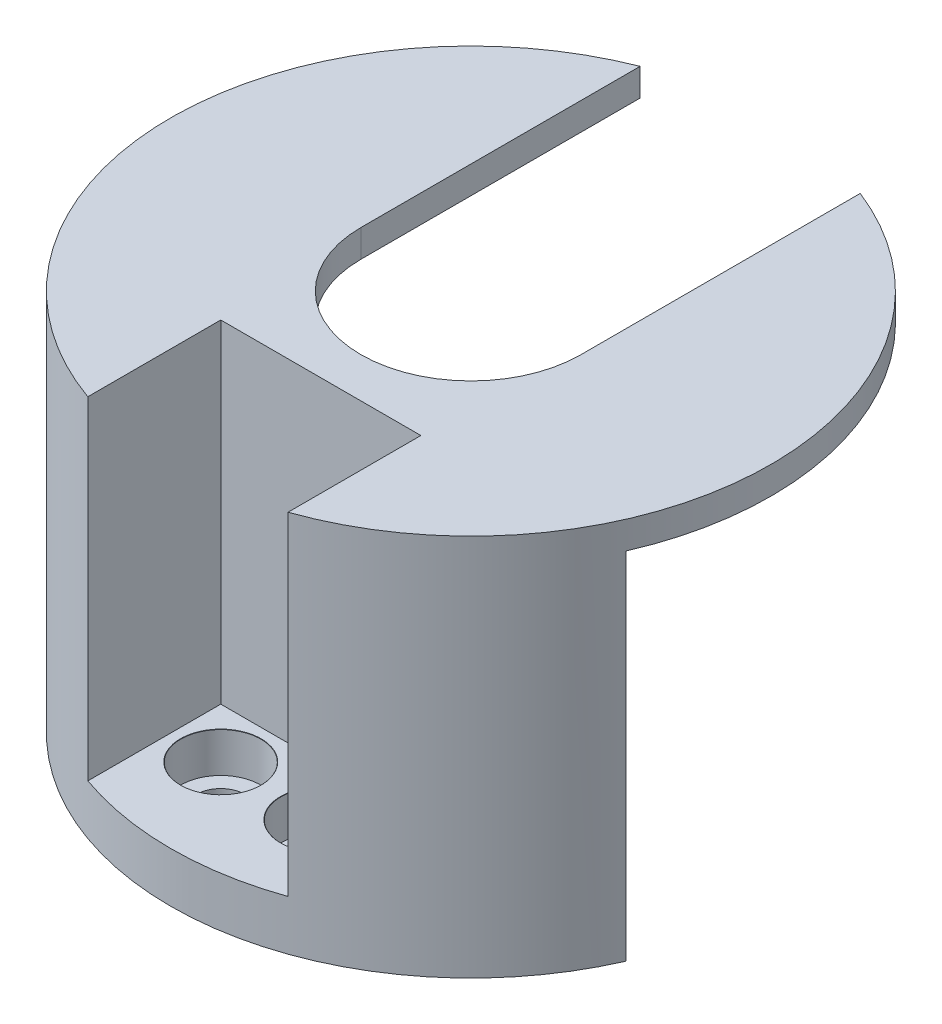
ISO-10303-21;
HEADER;
FILE_DESCRIPTION(('STEP AP214'),'2;1');
FILE_NAME('part.step','',(''),(''),'','','');
FILE_SCHEMA(('AUTOMOTIVE_DESIGN { 1 0 10303 214 1 1 1 1 }'));
ENDSEC;
DATA;
#1=APPLICATION_CONTEXT('core data for automotive mechanical design processes');
#2=APPLICATION_PROTOCOL_DEFINITION('international standard','automotive_design',2000,#1);
#3=PRODUCT_CONTEXT('',#1,'mechanical');
#4=PRODUCT('Part','Part','',(#3));
#5=PRODUCT_RELATED_PRODUCT_CATEGORY('part','',(#4));
#6=PRODUCT_DEFINITION_FORMATION('','',#4);
#7=PRODUCT_DEFINITION_CONTEXT('part definition',#1,'design');
#8=PRODUCT_DEFINITION('design','',#6,#7);
#9=PRODUCT_DEFINITION_SHAPE('','',#8);
#10=(LENGTH_UNIT() NAMED_UNIT(*) SI_UNIT(.MILLI.,.METRE.));
#11=(NAMED_UNIT(*) PLANE_ANGLE_UNIT() SI_UNIT($,.RADIAN.));
#12=(NAMED_UNIT(*) SI_UNIT($,.STERADIAN.) SOLID_ANGLE_UNIT());
#13=UNCERTAINTY_MEASURE_WITH_UNIT(LENGTH_MEASURE(1.E-05),#10,'distance_accuracy_value','');
#14=(GEOMETRIC_REPRESENTATION_CONTEXT(3) GLOBAL_UNCERTAINTY_ASSIGNED_CONTEXT((#13)) GLOBAL_UNIT_ASSIGNED_CONTEXT((#10,
#11,#12)) REPRESENTATION_CONTEXT('',''));
#15=CARTESIAN_POINT('',(0.,0.,0.));
#16=DIRECTION('',(0.,0.,1.));
#17=DIRECTION('',(1.,0.,0.));
#18=AXIS2_PLACEMENT_3D('',#15,#16,#17);
#19=CARTESIAN_POINT('',(0.,19.125,0.));
#20=DIRECTION('',(0.,-1.,0.));
#21=DIRECTION('',(0.,0.,-1.));
#22=AXIS2_PLACEMENT_3D('',#19,#20,#21);
#23=CYLINDRICAL_SURFACE('',#22,30.);
#24=DIRECTION('',(0.,1.,0.));
#25=VECTOR('',#24,1.);
#26=CARTESIAN_POINT('',(10.,-44.125,28.2842712474619));
#27=LINE('',#26,#25);
#28=CARTESIAN_POINT('',(10.,-14.125,28.2842712474619));
#29=VERTEX_POINT('',#28);
#30=CARTESIAN_POINT('',(10.,19.125,28.2842712474619));
#31=VERTEX_POINT('',#30);
#32=EDGE_CURVE('E138',#29,#31,#27,.T.);
#33=ORIENTED_EDGE('',*,*,#32,.F.);
#34=CARTESIAN_POINT('',(0.,-14.125,0.));
#35=DIRECTION('',(0.,1.,0.));
#36=DIRECTION('',(0.,0.,1.));
#37=AXIS2_PLACEMENT_3D('',#34,#35,#36);
#38=CIRCLE('',#37,30.);
#39=CARTESIAN_POINT('',(-9.99999999999999,-14.125,28.2842712474619));
#40=VERTEX_POINT('',#39);
#41=EDGE_CURVE('E137',#29,#40,#38,.F.);
#42=ORIENTED_EDGE('',*,*,#41,.T.);
#43=DIRECTION('',(0.,1.,0.));
#44=VECTOR('',#43,1.);
#45=CARTESIAN_POINT('',(-9.99999999999999,-44.125,28.2842712474619));
#46=LINE('',#45,#44);
#47=CARTESIAN_POINT('',(-9.99999999999999,19.125,28.2842712474619));
#48=VERTEX_POINT('',#47);
#49=EDGE_CURVE('E123',#40,#48,#46,.T.);
#50=ORIENTED_EDGE('',*,*,#49,.T.);
#51=CARTESIAN_POINT('',(0.,19.125,0.));
#52=DIRECTION('',(0.,1.,0.));
#53=DIRECTION('',(0.,0.,1.));
#54=AXIS2_PLACEMENT_3D('',#51,#52,#53);
#55=CIRCLE('',#54,30.);
#56=CARTESIAN_POINT('',(-11.,19.125,-27.9105714739057));
#57=VERTEX_POINT('',#56);
#58=EDGE_CURVE('E135',#57,#48,#55,.T.);
#59=ORIENTED_EDGE('',*,*,#58,.F.);
#60=DIRECTION('',(0.,1.,0.));
#61=VECTOR('',#60,1.);
#62=CARTESIAN_POINT('',(-11.,-33.375,-27.9105714739057));
#63=LINE('',#62,#61);
#64=CARTESIAN_POINT('',(-11.,16.375,-27.9105714739057));
#65=VERTEX_POINT('',#64);
#66=EDGE_CURVE('E194',#65,#57,#63,.T.);
#67=ORIENTED_EDGE('',*,*,#66,.F.);
#68=CARTESIAN_POINT('',(0.,16.375,0.));
#69=DIRECTION('',(0.,1.,0.));
#70=DIRECTION('',(0.,0.,1.));
#71=AXIS2_PLACEMENT_3D('',#68,#69,#70);
#72=CIRCLE('',#71,30.);
#73=CARTESIAN_POINT('',(-27.495454169735,16.375,12.));
#74=VERTEX_POINT('',#73);
#75=EDGE_CURVE('E148',#65,#74,#72,.T.);
#76=ORIENTED_EDGE('',*,*,#75,.T.);
#77=DIRECTION('',(0.,-1.,0.));
#78=VECTOR('',#77,1.);
#79=CARTESIAN_POINT('',(-27.495454169735,19.125,12.));
#80=LINE('',#79,#78);
#81=CARTESIAN_POINT('',(-27.495454169735,-19.125,12.));
#82=VERTEX_POINT('',#81);
#83=EDGE_CURVE('E153',#74,#82,#80,.T.);
#84=ORIENTED_EDGE('',*,*,#83,.T.);
#85=CARTESIAN_POINT('',(0.,-19.125,0.));
#86=DIRECTION('',(0.,1.,0.));
#87=DIRECTION('',(0.,0.,1.));
#88=AXIS2_PLACEMENT_3D('',#85,#86,#87);
#89=CIRCLE('',#88,30.);
#90=CARTESIAN_POINT('',(27.495454169735,-19.125,12.));
#91=VERTEX_POINT('',#90);
#92=EDGE_CURVE('E150',#82,#91,#89,.T.);
#93=ORIENTED_EDGE('',*,*,#92,.T.);
#94=DIRECTION('',(0.,-1.,0.));
#95=VECTOR('',#94,1.);
#96=CARTESIAN_POINT('',(27.495454169735,19.125,12.));
#97=LINE('',#96,#95);
#98=CARTESIAN_POINT('',(27.495454169735,16.375,12.));
#99=VERTEX_POINT('',#98);
#100=EDGE_CURVE('E210',#91,#99,#97,.F.);
#101=ORIENTED_EDGE('',*,*,#100,.T.);
#102=CARTESIAN_POINT('',(11.,16.375,-27.9105714739057));
#103=VERTEX_POINT('',#102);
#104=EDGE_CURVE('E157',#99,#103,#72,.T.);
#105=ORIENTED_EDGE('',*,*,#104,.T.);
#106=DIRECTION('',(0.,1.,0.));
#107=VECTOR('',#106,1.);
#108=CARTESIAN_POINT('',(11.,-33.375,-27.9105714739057));
#109=LINE('',#108,#107);
#110=CARTESIAN_POINT('',(11.,19.125,-27.9105714739057));
#111=VERTEX_POINT('',#110);
#112=EDGE_CURVE('E197',#103,#111,#109,.T.);
#113=ORIENTED_EDGE('',*,*,#112,.T.);
#114=EDGE_CURVE('E145',#31,#111,#55,.T.);
#115=ORIENTED_EDGE('',*,*,#114,.F.);
#116=EDGE_LOOP('',(#33,#42,#50,#59,#67,#76,#84,#93,#101,#105,#113,#115));
#117=FACE_BOUND('',#116,.T.);
#118=ADVANCED_FACE('F42',(#117),#23,.T.);
#119=CARTESIAN_POINT('',(0.,19.125,0.));
#120=DIRECTION('',(0.,1.,0.));
#121=DIRECTION('',(0.,0.,1.));
#122=AXIS2_PLACEMENT_3D('',#119,#120,#121);
#123=PLANE('',#122);
#124=DIRECTION('',(-1.,0.,0.));
#125=VECTOR('',#124,1.);
#126=CARTESIAN_POINT('',(0.,19.125,15.));
#127=LINE('',#126,#125);
#128=CARTESIAN_POINT('',(10.,19.125,15.));
#129=VERTEX_POINT('',#128);
#130=CARTESIAN_POINT('',(-9.99999999999999,19.125,15.));
#131=VERTEX_POINT('',#130);
#132=EDGE_CURVE('E58',#129,#131,#127,.T.);
#133=ORIENTED_EDGE('',*,*,#132,.F.);
#134=DIRECTION('',(0.,0.,1.));
#135=VECTOR('',#134,1.);
#136=CARTESIAN_POINT('',(10.,19.125,0.));
#137=LINE('',#136,#135);
#138=EDGE_CURVE('E128',#129,#31,#137,.T.);
#139=ORIENTED_EDGE('',*,*,#138,.T.);
#140=ORIENTED_EDGE('',*,*,#114,.T.);
#141=DIRECTION('',(0.,0.,1.));
#142=VECTOR('',#141,1.);
#143=CARTESIAN_POINT('',(11.,19.125,0.));
#144=LINE('',#143,#142);
#145=CARTESIAN_POINT('',(11.,19.125,0.));
#146=VERTEX_POINT('',#145);
#147=EDGE_CURVE('E204',#111,#146,#144,.T.);
#148=ORIENTED_EDGE('',*,*,#147,.T.);
#149=CARTESIAN_POINT('',(0.,19.125,0.));
#150=DIRECTION('',(0.,1.,0.));
#151=DIRECTION('',(0.,0.,1.));
#152=AXIS2_PLACEMENT_3D('',#149,#150,#151);
#153=CIRCLE('',#152,11.);
#154=CARTESIAN_POINT('',(-11.,19.125,0.));
#155=VERTEX_POINT('',#154);
#156=EDGE_CURVE('E196',#155,#146,#153,.T.);
#157=ORIENTED_EDGE('',*,*,#156,.F.);
#158=DIRECTION('',(0.,0.,1.));
#159=VECTOR('',#158,1.);
#160=CARTESIAN_POINT('',(-11.,19.125,0.));
#161=LINE('',#160,#159);
#162=EDGE_CURVE('E143',#57,#155,#161,.T.);
#163=ORIENTED_EDGE('',*,*,#162,.F.);
#164=ORIENTED_EDGE('',*,*,#58,.T.);
#165=DIRECTION('',(0.,0.,1.));
#166=VECTOR('',#165,1.);
#167=CARTESIAN_POINT('',(-10.,19.125,0.));
#168=LINE('',#167,#166);
#169=EDGE_CURVE('E120',#131,#48,#168,.T.);
#170=ORIENTED_EDGE('',*,*,#169,.F.);
#171=EDGE_LOOP('',(#133,#139,#140,#148,#157,#163,#164,#170));
#172=FACE_BOUND('',#171,.T.);
#173=ADVANCED_FACE('F141',(#172),#123,.T.);
#174=CARTESIAN_POINT('',(0.,-19.125,0.));
#175=DIRECTION('',(0.,1.,0.));
#176=DIRECTION('',(0.,0.,1.));
#177=AXIS2_PLACEMENT_3D('',#174,#175,#176);
#178=PLANE('',#177);
#179=CARTESIAN_POINT('',(-5.,-19.125,20.));
#180=DIRECTION('',(0.,1.,0.));
#181=DIRECTION('',(0.,0.,1.));
#182=AXIS2_PLACEMENT_3D('',#179,#180,#181);
#183=CIRCLE('',#182,2.4);
#184=CARTESIAN_POINT('',(-5.,-19.125,22.4));
#185=VERTEX_POINT('',#184);
#186=EDGE_CURVE('E45',#185,#185,#183,.T.);
#187=ORIENTED_EDGE('',*,*,#186,.T.);
#188=EDGE_LOOP('',(#187));
#189=FACE_BOUND('',#188,.T.);
#190=CARTESIAN_POINT('',(5.,-19.125,20.));
#191=DIRECTION('',(0.,1.,0.));
#192=DIRECTION('',(0.,0.,1.));
#193=AXIS2_PLACEMENT_3D('',#190,#191,#192);
#194=CIRCLE('',#193,2.4);
#195=CARTESIAN_POINT('',(5.,-19.125,22.4));
#196=VERTEX_POINT('',#195);
#197=EDGE_CURVE('E163',#196,#196,#194,.T.);
#198=ORIENTED_EDGE('',*,*,#197,.T.);
#199=EDGE_LOOP('',(#198));
#200=FACE_BOUND('',#199,.T.);
#201=ORIENTED_EDGE('',*,*,#92,.F.);
#202=DIRECTION('',(1.,0.,0.));
#203=VECTOR('',#202,1.);
#204=CARTESIAN_POINT('',(0.,-19.125,12.));
#205=LINE('',#204,#203);
#206=EDGE_CURVE('E144',#82,#91,#205,.T.);
#207=ORIENTED_EDGE('',*,*,#206,.T.);
#208=EDGE_LOOP('',(#201,#207));
#209=FACE_BOUND('',#208,.T.);
#210=ADVANCED_FACE('F219',(#189,#200,#209),#178,.F.);
#211=CARTESIAN_POINT('',(-52.5,16.375,-30.));
#212=DIRECTION('',(0.,1.,0.));
#213=DIRECTION('',(0.,0.,1.));
#214=AXIS2_PLACEMENT_3D('',#211,#212,#213);
#215=PLANE('',#214);
#216=ORIENTED_EDGE('',*,*,#75,.F.);
#217=DIRECTION('',(0.,0.,1.));
#218=VECTOR('',#217,1.);
#219=CARTESIAN_POINT('',(-11.,16.375,-30.));
#220=LINE('',#219,#218);
#221=CARTESIAN_POINT('',(-11.,16.375,0.));
#222=VERTEX_POINT('',#221);
#223=EDGE_CURVE('E12',#65,#222,#220,.T.);
#224=ORIENTED_EDGE('',*,*,#223,.T.);
#225=CARTESIAN_POINT('',(0.,16.375,0.));
#226=DIRECTION('',(0.,1.,0.));
#227=DIRECTION('',(0.,0.,1.));
#228=AXIS2_PLACEMENT_3D('',#225,#226,#227);
#229=CIRCLE('',#228,11.);
#230=CARTESIAN_POINT('',(11.,16.375,0.));
#231=VERTEX_POINT('',#230);
#232=EDGE_CURVE('E160',#222,#231,#229,.T.);
#233=ORIENTED_EDGE('',*,*,#232,.T.);
#234=DIRECTION('',(0.,0.,1.));
#235=VECTOR('',#234,1.);
#236=CARTESIAN_POINT('',(11.,16.375,-30.));
#237=LINE('',#236,#235);
#238=EDGE_CURVE('E50',#103,#231,#237,.T.);
#239=ORIENTED_EDGE('',*,*,#238,.F.);
#240=ORIENTED_EDGE('',*,*,#104,.F.);
#241=DIRECTION('',(1.,0.,0.));
#242=VECTOR('',#241,1.);
#243=CARTESIAN_POINT('',(-52.5,16.375,12.));
#244=LINE('',#243,#242);
#245=EDGE_CURVE('E208',#74,#99,#244,.T.);
#246=ORIENTED_EDGE('',*,*,#245,.F.);
#247=EDGE_LOOP('',(#216,#224,#233,#239,#240,#246));
#248=FACE_BOUND('',#247,.T.);
#249=ADVANCED_FACE('F222',(#248),#215,.F.);
#250=CARTESIAN_POINT('',(-52.5,16.375,12.));
#251=DIRECTION('',(0.,0.,1.));
#252=DIRECTION('',(0.,-1.,0.));
#253=AXIS2_PLACEMENT_3D('',#250,#251,#252);
#254=PLANE('',#253);
#255=ORIENTED_EDGE('',*,*,#245,.T.);
#256=ORIENTED_EDGE('',*,*,#100,.F.);
#257=ORIENTED_EDGE('',*,*,#206,.F.);
#258=ORIENTED_EDGE('',*,*,#83,.F.);
#259=EDGE_LOOP('',(#255,#256,#257,#258));
#260=FACE_BOUND('',#259,.T.);
#261=ADVANCED_FACE('F220',(#260),#254,.F.);
#262=CARTESIAN_POINT('',(-11.,-33.375,0.));
#263=DIRECTION('',(-1.,0.,0.));
#264=DIRECTION('',(0.,0.,1.));
#265=AXIS2_PLACEMENT_3D('',#262,#263,#264);
#266=PLANE('',#265);
#267=ORIENTED_EDGE('',*,*,#162,.T.);
#268=DIRECTION('',(0.,1.,0.));
#269=VECTOR('',#268,1.);
#270=CARTESIAN_POINT('',(-11.,-33.375,0.));
#271=LINE('',#270,#269);
#272=EDGE_CURVE('E193',#222,#155,#271,.T.);
#273=ORIENTED_EDGE('',*,*,#272,.F.);
#274=ORIENTED_EDGE('',*,*,#223,.F.);
#275=ORIENTED_EDGE('',*,*,#66,.T.);
#276=EDGE_LOOP('',(#267,#273,#274,#275));
#277=FACE_BOUND('',#276,.T.);
#278=ADVANCED_FACE('F259',(#277),#266,.F.);
#279=CARTESIAN_POINT('',(11.,-33.375,0.));
#280=DIRECTION('',(-1.,0.,0.));
#281=DIRECTION('',(0.,0.,1.));
#282=AXIS2_PLACEMENT_3D('',#279,#280,#281);
#283=PLANE('',#282);
#284=ORIENTED_EDGE('',*,*,#112,.F.);
#285=ORIENTED_EDGE('',*,*,#238,.T.);
#286=DIRECTION('',(0.,1.,0.));
#287=VECTOR('',#286,1.);
#288=CARTESIAN_POINT('',(11.,-33.375,0.));
#289=LINE('',#288,#287);
#290=EDGE_CURVE('E66',#231,#146,#289,.T.);
#291=ORIENTED_EDGE('',*,*,#290,.T.);
#292=ORIENTED_EDGE('',*,*,#147,.F.);
#293=EDGE_LOOP('',(#284,#285,#291,#292));
#294=FACE_BOUND('',#293,.T.);
#295=ADVANCED_FACE('F227',(#294),#283,.T.);
#296=CARTESIAN_POINT('',(0.,-33.375,0.));
#297=DIRECTION('',(0.,1.,0.));
#298=DIRECTION('',(0.,0.,1.));
#299=AXIS2_PLACEMENT_3D('',#296,#297,#298);
#300=CYLINDRICAL_SURFACE('',#299,11.);
#301=ORIENTED_EDGE('',*,*,#156,.T.);
#302=ORIENTED_EDGE('',*,*,#290,.F.);
#303=ORIENTED_EDGE('',*,*,#232,.F.);
#304=ORIENTED_EDGE('',*,*,#272,.T.);
#305=EDGE_LOOP('',(#301,#302,#303,#304));
#306=FACE_BOUND('',#305,.T.);
#307=ADVANCED_FACE('F237',(#306),#300,.F.);
#308=CARTESIAN_POINT('',(0.,-44.125,15.));
#309=DIRECTION('',(0.,0.,-1.));
#310=DIRECTION('',(-1.,0.,0.));
#311=AXIS2_PLACEMENT_3D('',#308,#309,#310);
#312=PLANE('',#311);
#313=DIRECTION('',(1.,0.,0.));
#314=VECTOR('',#313,1.);
#315=CARTESIAN_POINT('',(0.,-14.125,15.));
#316=LINE('',#315,#314);
#317=CARTESIAN_POINT('',(-9.99999999999999,-14.125,15.));
#318=VERTEX_POINT('',#317);
#319=CARTESIAN_POINT('',(10.,-14.125,15.));
#320=VERTEX_POINT('',#319);
#321=EDGE_CURVE('E184',#318,#320,#316,.T.);
#322=ORIENTED_EDGE('',*,*,#321,.T.);
#323=DIRECTION('',(0.,1.,0.));
#324=VECTOR('',#323,1.);
#325=CARTESIAN_POINT('',(10.,-44.125,15.));
#326=LINE('',#325,#324);
#327=EDGE_CURVE('E181',#320,#129,#326,.T.);
#328=ORIENTED_EDGE('',*,*,#327,.T.);
#329=ORIENTED_EDGE('',*,*,#132,.T.);
#330=DIRECTION('',(0.,1.,0.));
#331=VECTOR('',#330,1.);
#332=CARTESIAN_POINT('',(-9.99999999999999,-44.125,15.));
#333=LINE('',#332,#331);
#334=EDGE_CURVE('E125',#318,#131,#333,.T.);
#335=ORIENTED_EDGE('',*,*,#334,.F.);
#336=EDGE_LOOP('',(#322,#328,#329,#335));
#337=FACE_BOUND('',#336,.T.);
#338=ADVANCED_FACE('F235',(#337),#312,.F.);
#339=CARTESIAN_POINT('',(10.,-44.125,0.));
#340=DIRECTION('',(-1.,0.,0.));
#341=DIRECTION('',(0.,0.,1.));
#342=AXIS2_PLACEMENT_3D('',#339,#340,#341);
#343=PLANE('',#342);
#344=ORIENTED_EDGE('',*,*,#32,.T.);
#345=ORIENTED_EDGE('',*,*,#138,.F.);
#346=ORIENTED_EDGE('',*,*,#327,.F.);
#347=DIRECTION('',(0.,0.,-1.));
#348=VECTOR('',#347,1.);
#349=CARTESIAN_POINT('',(10.,-14.125,0.));
#350=LINE('',#349,#348);
#351=EDGE_CURVE('E180',#29,#320,#350,.T.);
#352=ORIENTED_EDGE('',*,*,#351,.F.);
#353=EDGE_LOOP('',(#344,#345,#346,#352));
#354=FACE_BOUND('',#353,.T.);
#355=ADVANCED_FACE('F231',(#354),#343,.T.);
#356=CARTESIAN_POINT('',(-10.,-44.125,0.));
#357=DIRECTION('',(-1.,0.,0.));
#358=DIRECTION('',(0.,0.,1.));
#359=AXIS2_PLACEMENT_3D('',#356,#357,#358);
#360=PLANE('',#359);
#361=DIRECTION('',(0.,0.,-1.));
#362=VECTOR('',#361,1.);
#363=CARTESIAN_POINT('',(-10.,-14.125,0.));
#364=LINE('',#363,#362);
#365=EDGE_CURVE('E185',#40,#318,#364,.T.);
#366=ORIENTED_EDGE('',*,*,#365,.T.);
#367=ORIENTED_EDGE('',*,*,#334,.T.);
#368=ORIENTED_EDGE('',*,*,#169,.T.);
#369=ORIENTED_EDGE('',*,*,#49,.F.);
#370=EDGE_LOOP('',(#366,#367,#368,#369));
#371=FACE_BOUND('',#370,.T.);
#372=ADVANCED_FACE('F122',(#371),#360,.F.);
#373=CARTESIAN_POINT('',(0.,-14.125,0.));
#374=DIRECTION('',(0.,1.,0.));
#375=DIRECTION('',(0.,0.,1.));
#376=AXIS2_PLACEMENT_3D('',#373,#374,#375);
#377=PLANE('',#376);
#378=CARTESIAN_POINT('',(-5.,-14.125,20.));
#379=DIRECTION('',(0.,1.,0.));
#380=DIRECTION('',(0.,0.,1.));
#381=AXIS2_PLACEMENT_3D('',#378,#379,#380);
#382=CIRCLE('',#381,4.025);
#383=CARTESIAN_POINT('',(-5.,-14.125,24.025));
#384=VERTEX_POINT('',#383);
#385=EDGE_CURVE('E429',#384,#384,#382,.T.);
#386=ORIENTED_EDGE('',*,*,#385,.F.);
#387=EDGE_LOOP('',(#386));
#388=FACE_BOUND('',#387,.T.);
#389=CARTESIAN_POINT('',(5.,-14.125,20.));
#390=DIRECTION('',(0.,1.,0.));
#391=DIRECTION('',(0.,0.,1.));
#392=AXIS2_PLACEMENT_3D('',#389,#390,#391);
#393=CIRCLE('',#392,4.025);
#394=CARTESIAN_POINT('',(5.,-14.125,24.025));
#395=VERTEX_POINT('',#394);
#396=EDGE_CURVE('E439',#395,#395,#393,.T.);
#397=ORIENTED_EDGE('',*,*,#396,.F.);
#398=EDGE_LOOP('',(#397));
#399=FACE_BOUND('',#398,.T.);
#400=ORIENTED_EDGE('',*,*,#321,.F.);
#401=ORIENTED_EDGE('',*,*,#365,.F.);
#402=ORIENTED_EDGE('',*,*,#41,.F.);
#403=ORIENTED_EDGE('',*,*,#351,.T.);
#404=EDGE_LOOP('',(#400,#401,#402,#403));
#405=FACE_BOUND('',#404,.T.);
#406=ADVANCED_FACE('F234',(#388,#399,#405),#377,.T.);
#407=CARTESIAN_POINT('',(5.,-14.125,20.));
#408=DIRECTION('',(0.,1.,0.));
#409=DIRECTION('',(0.,0.,1.));
#410=AXIS2_PLACEMENT_3D('',#407,#408,#409);
#411=CYLINDRICAL_SURFACE('',#410,2.4);
#412=CARTESIAN_POINT('',(5.,-18.125,20.));
#413=DIRECTION('',(0.,1.,0.));
#414=DIRECTION('',(0.,0.,1.));
#415=AXIS2_PLACEMENT_3D('',#412,#413,#414);
#416=CIRCLE('',#415,2.4);
#417=CARTESIAN_POINT('',(5.,-18.125,22.4));
#418=VERTEX_POINT('',#417);
#419=EDGE_CURVE('E165',#418,#418,#416,.T.);
#420=ORIENTED_EDGE('',*,*,#419,.T.);
#421=EDGE_LOOP('',(#420));
#422=FACE_BOUND('',#421,.T.);
#423=ORIENTED_EDGE('',*,*,#197,.F.);
#424=EDGE_LOOP('',(#423));
#425=FACE_BOUND('',#424,.T.);
#426=ADVANCED_FACE('F319',(#422,#425),#411,.F.);
#427=CARTESIAN_POINT('',(7.4,-18.125,20.));
#428=DIRECTION('',(0.,-1.,0.));
#429=DIRECTION('',(0.,0.,-1.));
#430=AXIS2_PLACEMENT_3D('',#427,#428,#429);
#431=PLANE('',#430);
#432=ORIENTED_EDGE('',*,*,#419,.F.);
#433=EDGE_LOOP('',(#432));
#434=FACE_BOUND('',#433,.T.);
#435=CARTESIAN_POINT('',(5.,-18.125,20.));
#436=DIRECTION('',(0.,1.,0.));
#437=DIRECTION('',(0.,0.,1.));
#438=AXIS2_PLACEMENT_3D('',#435,#436,#437);
#439=CIRCLE('',#438,4.);
#440=CARTESIAN_POINT('',(5.,-18.125,24.));
#441=VERTEX_POINT('',#440);
#442=EDGE_CURVE('E170',#441,#441,#439,.T.);
#443=ORIENTED_EDGE('',*,*,#442,.T.);
#444=EDGE_LOOP('',(#443));
#445=FACE_BOUND('',#444,.T.);
#446=ADVANCED_FACE('F330',(#434,#445),#431,.F.);
#447=CARTESIAN_POINT('',(5.,-14.125,20.));
#448=DIRECTION('',(0.,1.,0.));
#449=DIRECTION('',(0.,0.,1.));
#450=AXIS2_PLACEMENT_3D('',#447,#448,#449);
#451=CYLINDRICAL_SURFACE('',#450,4.);
#452=ORIENTED_EDGE('',*,*,#442,.F.);
#453=EDGE_LOOP('',(#452));
#454=FACE_BOUND('',#453,.T.);
#455=CARTESIAN_POINT('',(5.,-14.15,20.));
#456=DIRECTION('',(0.,1.,0.));
#457=DIRECTION('',(0.,0.,1.));
#458=AXIS2_PLACEMENT_3D('',#455,#456,#457);
#459=CIRCLE('',#458,4.);
#460=CARTESIAN_POINT('',(5.,-14.15,24.));
#461=VERTEX_POINT('',#460);
#462=EDGE_CURVE('E175',#461,#461,#459,.T.);
#463=ORIENTED_EDGE('',*,*,#462,.T.);
#464=EDGE_LOOP('',(#463));
#465=FACE_BOUND('',#464,.T.);
#466=ADVANCED_FACE('F340',(#454,#465),#451,.F.);
#467=CARTESIAN_POINT('',(5.,-14.125,20.));
#468=DIRECTION('',(0.,1.,0.));
#469=DIRECTION('',(0.,0.,1.));
#470=AXIS2_PLACEMENT_3D('',#467,#468,#469);
#471=CONICAL_SURFACE('',#470,4.025,0.785398163397448);
#472=ORIENTED_EDGE('',*,*,#462,.F.);
#473=EDGE_LOOP('',(#472));
#474=FACE_BOUND('',#473,.T.);
#475=ORIENTED_EDGE('',*,*,#396,.T.);
#476=EDGE_LOOP('',(#475));
#477=FACE_BOUND('',#476,.T.);
#478=ADVANCED_FACE('F351',(#474,#477),#471,.F.);
#479=CARTESIAN_POINT('',(-5.,-14.125,20.));
#480=DIRECTION('',(0.,1.,0.));
#481=DIRECTION('',(0.,0.,1.));
#482=AXIS2_PLACEMENT_3D('',#479,#480,#481);
#483=CYLINDRICAL_SURFACE('',#482,2.4);
#484=CARTESIAN_POINT('',(-5.,-18.125,20.));
#485=DIRECTION('',(0.,1.,0.));
#486=DIRECTION('',(0.,0.,1.));
#487=AXIS2_PLACEMENT_3D('',#484,#485,#486);
#488=CIRCLE('',#487,2.4);
#489=CARTESIAN_POINT('',(-5.,-18.125,22.4));
#490=VERTEX_POINT('',#489);
#491=EDGE_CURVE('E436',#490,#490,#488,.T.);
#492=ORIENTED_EDGE('',*,*,#491,.T.);
#493=EDGE_LOOP('',(#492));
#494=FACE_BOUND('',#493,.T.);
#495=ORIENTED_EDGE('',*,*,#186,.F.);
#496=EDGE_LOOP('',(#495));
#497=FACE_BOUND('',#496,.T.);
#498=ADVANCED_FACE('F362',(#494,#497),#483,.F.);
#499=CARTESIAN_POINT('',(-2.6,-18.125,20.));
#500=DIRECTION('',(0.,-1.,0.));
#501=DIRECTION('',(0.,0.,-1.));
#502=AXIS2_PLACEMENT_3D('',#499,#500,#501);
#503=PLANE('',#502);
#504=ORIENTED_EDGE('',*,*,#491,.F.);
#505=EDGE_LOOP('',(#504));
#506=FACE_BOUND('',#505,.T.);
#507=CARTESIAN_POINT('',(-5.,-18.125,20.));
#508=DIRECTION('',(0.,1.,0.));
#509=DIRECTION('',(0.,0.,1.));
#510=AXIS2_PLACEMENT_3D('',#507,#508,#509);
#511=CIRCLE('',#510,4.);
#512=CARTESIAN_POINT('',(-5.,-18.125,24.));
#513=VERTEX_POINT('',#512);
#514=EDGE_CURVE('E431',#513,#513,#511,.T.);
#515=ORIENTED_EDGE('',*,*,#514,.T.);
#516=EDGE_LOOP('',(#515));
#517=FACE_BOUND('',#516,.T.);
#518=ADVANCED_FACE('F373',(#506,#517),#503,.F.);
#519=CARTESIAN_POINT('',(-5.,-14.125,20.));
#520=DIRECTION('',(0.,1.,0.));
#521=DIRECTION('',(0.,0.,1.));
#522=AXIS2_PLACEMENT_3D('',#519,#520,#521);
#523=CYLINDRICAL_SURFACE('',#522,4.);
#524=ORIENTED_EDGE('',*,*,#514,.F.);
#525=EDGE_LOOP('',(#524));
#526=FACE_BOUND('',#525,.T.);
#527=CARTESIAN_POINT('',(-5.,-14.15,20.));
#528=DIRECTION('',(0.,1.,0.));
#529=DIRECTION('',(0.,0.,1.));
#530=AXIS2_PLACEMENT_3D('',#527,#528,#529);
#531=CIRCLE('',#530,4.);
#532=CARTESIAN_POINT('',(-5.,-14.15,24.));
#533=VERTEX_POINT('',#532);
#534=EDGE_CURVE('E426',#533,#533,#531,.T.);
#535=ORIENTED_EDGE('',*,*,#534,.T.);
#536=EDGE_LOOP('',(#535));
#537=FACE_BOUND('',#536,.T.);
#538=ADVANCED_FACE('F384',(#526,#537),#523,.F.);
#539=CARTESIAN_POINT('',(-5.,-14.125,20.));
#540=DIRECTION('',(0.,1.,0.));
#541=DIRECTION('',(0.,0.,1.));
#542=AXIS2_PLACEMENT_3D('',#539,#540,#541);
#543=CONICAL_SURFACE('',#542,4.025,0.785398163397448);
#544=ORIENTED_EDGE('',*,*,#534,.F.);
#545=EDGE_LOOP('',(#544));
#546=FACE_BOUND('',#545,.T.);
#547=ORIENTED_EDGE('',*,*,#385,.T.);
#548=EDGE_LOOP('',(#547));
#549=FACE_BOUND('',#548,.T.);
#550=ADVANCED_FACE('F395',(#546,#549),#543,.F.);
#551=CLOSED_SHELL('',(#118,#173,#210,#249,#261,#278,#295,#307,#338,#355,#372,#406,#426,#446,
#466,#478,#498,#518,#538,#550));
#552=MANIFOLD_SOLID_BREP('B2',#551);
#553=ADVANCED_BREP_SHAPE_REPRESENTATION('',(#18,#552),#14);
#554=SHAPE_DEFINITION_REPRESENTATION(#9,#553);
ENDSEC;
END-ISO-10303-21;
